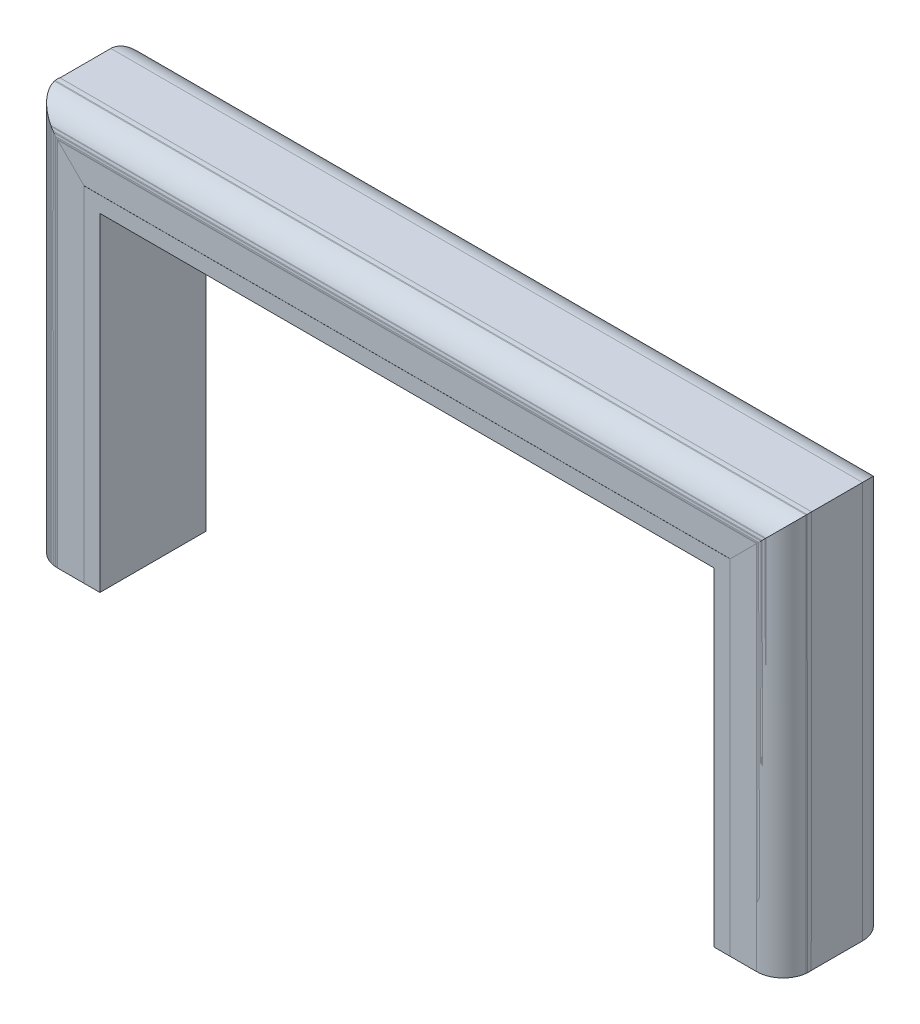
ISO-10303-21;
HEADER;
FILE_DESCRIPTION(('STEP AP214'),'2;1');
FILE_NAME('part.step','',(''),(''),'','','');
FILE_SCHEMA(('AUTOMOTIVE_DESIGN { 1 0 10303 214 1 1 1 1 }'));
ENDSEC;
DATA;
#1=APPLICATION_CONTEXT('core data for automotive mechanical design processes');
#2=APPLICATION_PROTOCOL_DEFINITION('international standard','automotive_design',2000,#1);
#3=PRODUCT_CONTEXT('',#1,'mechanical');
#4=PRODUCT('Part','Part','',(#3));
#5=PRODUCT_RELATED_PRODUCT_CATEGORY('part','',(#4));
#6=PRODUCT_DEFINITION_FORMATION('','',#4);
#7=PRODUCT_DEFINITION_CONTEXT('part definition',#1,'design');
#8=PRODUCT_DEFINITION('design','',#6,#7);
#9=PRODUCT_DEFINITION_SHAPE('','',#8);
#10=(LENGTH_UNIT() NAMED_UNIT(*) SI_UNIT(.MILLI.,.METRE.));
#11=(NAMED_UNIT(*) PLANE_ANGLE_UNIT() SI_UNIT($,.RADIAN.));
#12=(NAMED_UNIT(*) SI_UNIT($,.STERADIAN.) SOLID_ANGLE_UNIT());
#13=UNCERTAINTY_MEASURE_WITH_UNIT(LENGTH_MEASURE(1.E-05),#10,'distance_accuracy_value','');
#14=(GEOMETRIC_REPRESENTATION_CONTEXT(3) GLOBAL_UNCERTAINTY_ASSIGNED_CONTEXT((#13)) GLOBAL_UNIT_ASSIGNED_CONTEXT((#10,
#11,#12)) REPRESENTATION_CONTEXT('',''));
#15=CARTESIAN_POINT('',(0.,0.,0.));
#16=DIRECTION('',(0.,0.,1.));
#17=DIRECTION('',(1.,0.,0.));
#18=AXIS2_PLACEMENT_3D('',#15,#16,#17);
#19=CARTESIAN_POINT('',(0.126999999999988,0.,0.));
#20=DIRECTION('',(0.,1.,0.));
#21=DIRECTION('',(-1.,0.,0.));
#22=AXIS2_PLACEMENT_3D('',#19,#20,#21);
#23=PLANE('',#22);
#24=DIRECTION('',(0.,0.,-1.));
#25=VECTOR('',#24,1.);
#26=CARTESIAN_POINT('',(450.723,2.14008705028475E-12,0.));
#27=LINE('',#26,#25);
#28=CARTESIAN_POINT('',(450.723,2.1525109741519E-12,99.2580523948669));
#29=VERTEX_POINT('',#28);
#30=CARTESIAN_POINT('',(450.723,2.1525109741519E-12,31.623));
#31=VERTEX_POINT('',#30);
#32=EDGE_CURVE('E115',#29,#31,#27,.T.);
#33=ORIENTED_EDGE('',*,*,#32,.F.);
#34=CARTESIAN_POINT('',(419.227,1.98684066570759E-12,95.25));
#35=DIRECTION('',(0.,1.,0.));
#36=DIRECTION('',(-1.,0.,0.));
#37=AXIS2_PLACEMENT_3D('',#34,#35,#36);
#38=CIRCLE('',#37,31.75);
#39=CARTESIAN_POINT('',(419.227,1.99262111479377E-12,127.));
#40=VERTEX_POINT('',#39);
#41=EDGE_CURVE('E122',#40,#29,#38,.T.);
#42=ORIENTED_EDGE('',*,*,#41,.F.);
#43=DIRECTION('',(-1.,0.,0.));
#44=VECTOR('',#43,1.);
#45=CARTESIAN_POINT('',(0.126999999999988,0.,127.));
#46=LINE('',#45,#44);
#47=CARTESIAN_POINT('',(387.477,1.83211332694764E-12,127.));
#48=VERTEX_POINT('',#47);
#49=EDGE_CURVE('E130',#48,#40,#46,.F.);
#50=ORIENTED_EDGE('',*,*,#49,.F.);
#51=DIRECTION('',(0.,0.,-1.));
#52=VECTOR('',#51,1.);
#53=CARTESIAN_POINT('',(387.477,1.83235866326378E-12,0.));
#54=LINE('',#53,#52);
#55=CARTESIAN_POINT('',(387.477,1.83211332694764E-12,0.));
#56=VERTEX_POINT('',#55);
#57=EDGE_CURVE('E160',#56,#48,#54,.F.);
#58=ORIENTED_EDGE('',*,*,#57,.F.);
#59=DIRECTION('',(1.,0.,0.));
#60=VECTOR('',#59,1.);
#61=CARTESIAN_POINT('',(0.126999999999988,0.,0.));
#62=LINE('',#61,#60);
#63=CARTESIAN_POINT('',(419.1,1.99231215054977E-12,0.));
#64=VERTEX_POINT('',#63);
#65=EDGE_CURVE('E158',#64,#56,#62,.F.);
#66=ORIENTED_EDGE('',*,*,#65,.F.);
#67=CARTESIAN_POINT('',(419.1,1.9862220252348E-12,31.623));
#68=DIRECTION('',(0.,1.,0.));
#69=DIRECTION('',(-1.,0.,0.));
#70=AXIS2_PLACEMENT_3D('',#67,#68,#69);
#71=CIRCLE('',#70,31.623);
#72=EDGE_CURVE('E133',#31,#64,#71,.T.);
#73=ORIENTED_EDGE('',*,*,#72,.F.);
#74=EDGE_LOOP('',(#33,#42,#50,#58,#66,#73));
#75=FACE_BOUND('',#74,.T.);
#76=ADVANCED_FACE('F56',(#75),#23,.F.);
#77=CARTESIAN_POINT('',(0.,0.,0.));
#78=DIRECTION('',(0.,-1.,0.));
#79=DIRECTION('',(1.,0.,0.));
#80=AXIS2_PLACEMENT_3D('',#77,#78,#79);
#81=PLANE('',#80);
#82=DIRECTION('',(0.,0.,-1.));
#83=VECTOR('',#82,1.);
#84=CARTESIAN_POINT('',(-450.596,-2.13722818049158E-12,0.));
#85=LINE('',#84,#83);
#86=CARTESIAN_POINT('',(-450.596,-2.13722818049158E-12,99.2580523948669));
#87=VERTEX_POINT('',#86);
#88=CARTESIAN_POINT('',(-450.596,-2.13722818049158E-12,31.623));
#89=VERTEX_POINT('',#88);
#90=EDGE_CURVE('E190',#87,#89,#85,.T.);
#91=ORIENTED_EDGE('',*,*,#90,.T.);
#92=CARTESIAN_POINT('',(-418.973,-1.98723585601458E-12,31.623));
#93=DIRECTION('',(0.,-1.,0.));
#94=DIRECTION('',(1.,0.,0.));
#95=AXIS2_PLACEMENT_3D('',#92,#93,#94);
#96=CIRCLE('',#95,31.623);
#97=CARTESIAN_POINT('',(-418.973,-1.98723668755404E-12,0.));
#98=VERTEX_POINT('',#97);
#99=EDGE_CURVE('E218',#89,#98,#96,.T.);
#100=ORIENTED_EDGE('',*,*,#99,.T.);
#101=DIRECTION('',(-1.,0.,0.));
#102=VECTOR('',#101,1.);
#103=CARTESIAN_POINT('',(0.,0.,0.));
#104=LINE('',#103,#102);
#105=CARTESIAN_POINT('',(-387.35,-1.8372451946165E-12,0.));
#106=VERTEX_POINT('',#105);
#107=EDGE_CURVE('E212',#98,#106,#104,.F.);
#108=ORIENTED_EDGE('',*,*,#107,.T.);
#109=DIRECTION('',(0.,0.,-1.));
#110=VECTOR('',#109,1.);
#111=CARTESIAN_POINT('',(-387.35,-1.8372451946165E-12,0.));
#112=LINE('',#111,#110);
#113=CARTESIAN_POINT('',(-387.35,-1.8372451946165E-12,127.));
#114=VERTEX_POINT('',#113);
#115=EDGE_CURVE('E206',#106,#114,#112,.F.);
#116=ORIENTED_EDGE('',*,*,#115,.T.);
#117=DIRECTION('',(1.,0.,0.));
#118=VECTOR('',#117,1.);
#119=CARTESIAN_POINT('',(0.,0.,127.));
#120=LINE('',#119,#118);
#121=CARTESIAN_POINT('',(-419.1,-1.98783906302768E-12,127.));
#122=VERTEX_POINT('',#121);
#123=EDGE_CURVE('E200',#114,#122,#120,.F.);
#124=ORIENTED_EDGE('',*,*,#123,.T.);
#125=CARTESIAN_POINT('',(-419.1,-1.98783894347302E-12,95.25));
#126=DIRECTION('',(0.,-1.,0.));
#127=DIRECTION('',(1.,0.,0.));
#128=AXIS2_PLACEMENT_3D('',#125,#126,#127);
#129=CIRCLE('',#128,31.75);
#130=EDGE_CURVE('E196',#122,#87,#129,.T.);
#131=ORIENTED_EDGE('',*,*,#130,.T.);
#132=EDGE_LOOP('',(#91,#100,#108,#116,#124,#131));
#133=FACE_BOUND('',#132,.T.);
#134=ADVANCED_FACE('F285',(#133),#81,.T.);
#135=CARTESIAN_POINT('',(450.723,479.3853,0.));
#136=DIRECTION('',(-1.,0.,0.));
#137=DIRECTION('',(0.,-1.,0.));
#138=AXIS2_PLACEMENT_3D('',#135,#136,#137);
#139=PLANE('',#138);
#140=DIRECTION('',(0.,0.,1.));
#141=VECTOR('',#140,1.);
#142=CARTESIAN_POINT('',(450.723,476.123,0.));
#143=LINE('',#142,#141);
#144=CARTESIAN_POINT('',(450.723,476.123,31.623));
#145=VERTEX_POINT('',#144);
#146=CARTESIAN_POINT('',(450.723,476.123,99.2580523948669));
#147=VERTEX_POINT('',#146);
#148=EDGE_CURVE('E137',#145,#147,#143,.T.);
#149=ORIENTED_EDGE('',*,*,#148,.T.);
#150=DIRECTION('',(0.,-1.,0.));
#151=VECTOR('',#150,1.);
#152=CARTESIAN_POINT('',(450.723,479.3853,99.2580523948669));
#153=LINE('',#152,#151);
#154=EDGE_CURVE('E59',#147,#29,#153,.T.);
#155=ORIENTED_EDGE('',*,*,#154,.T.);
#156=ORIENTED_EDGE('',*,*,#32,.T.);
#157=DIRECTION('',(0.,-1.,0.));
#158=VECTOR('',#157,1.);
#159=CARTESIAN_POINT('',(450.723,479.3853,31.623));
#160=LINE('',#159,#158);
#161=EDGE_CURVE('E140',#145,#31,#160,.T.);
#162=ORIENTED_EDGE('',*,*,#161,.F.);
#163=EDGE_LOOP('',(#149,#155,#156,#162));
#164=FACE_BOUND('',#163,.T.);
#165=ADVANCED_FACE('F136',(#164),#139,.F.);
#166=CARTESIAN_POINT('',(419.1,479.3853,31.623));
#167=DIRECTION('',(0.,-1.,0.));
#168=DIRECTION('',(1.,0.,0.));
#169=AXIS2_PLACEMENT_3D('',#166,#167,#168);
#170=CYLINDRICAL_SURFACE('',#169,31.623);
#171=CARTESIAN_POINT('',(419.1,444.5,31.623));
#172=DIRECTION('',(0.707106781186548,-0.707106781186547,0.));
#173=DIRECTION('',(0.707106781186547,0.707106781186548,0.));
#174=AXIS2_PLACEMENT_3D('',#171,#172,#173);
#175=ELLIPSE('',#174,44.7216754829244,31.623);
#176=CARTESIAN_POINT('',(419.1,444.5,0.));
#177=VERTEX_POINT('',#176);
#178=EDGE_CURVE('E188',#177,#145,#175,.T.);
#179=ORIENTED_EDGE('',*,*,#178,.T.);
#180=ORIENTED_EDGE('',*,*,#161,.T.);
#181=ORIENTED_EDGE('',*,*,#72,.T.);
#182=DIRECTION('',(0.,-1.,0.));
#183=VECTOR('',#182,1.);
#184=CARTESIAN_POINT('',(419.1,479.3853,0.));
#185=LINE('',#184,#183);
#186=EDGE_CURVE('E144',#177,#64,#185,.T.);
#187=ORIENTED_EDGE('',*,*,#186,.F.);
#188=EDGE_LOOP('',(#179,#180,#181,#187));
#189=FACE_BOUND('',#188,.T.);
#190=ADVANCED_FACE('F297',(#189),#170,.T.);
#191=CARTESIAN_POINT('',(0.126999999999933,479.385299999998,0.));
#192=DIRECTION('',(0.,0.,1.));
#193=DIRECTION('',(1.,0.,0.));
#194=AXIS2_PLACEMENT_3D('',#191,#192,#193);
#195=PLANE('',#194);
#196=DIRECTION('',(0.707106781186547,0.707106781186548,0.));
#197=VECTOR('',#196,1.);
#198=CARTESIAN_POINT('',(-226.865649999999,-201.465649999999,0.));
#199=LINE('',#198,#197);
#200=CARTESIAN_POINT('',(387.477,412.877,0.));
#201=VERTEX_POINT('',#200);
#202=EDGE_CURVE('E185',#201,#177,#199,.T.);
#203=ORIENTED_EDGE('',*,*,#202,.T.);
#204=ORIENTED_EDGE('',*,*,#186,.T.);
#205=ORIENTED_EDGE('',*,*,#65,.T.);
#206=DIRECTION('',(0.,-1.,0.));
#207=VECTOR('',#206,1.);
#208=CARTESIAN_POINT('',(387.477,479.3853,0.));
#209=LINE('',#208,#207);
#210=EDGE_CURVE('E148',#201,#56,#209,.T.);
#211=ORIENTED_EDGE('',*,*,#210,.F.);
#212=EDGE_LOOP('',(#203,#204,#205,#211));
#213=FACE_BOUND('',#212,.T.);
#214=ADVANCED_FACE('F300',(#213),#195,.F.);
#215=CARTESIAN_POINT('',(387.477,479.3853,0.));
#216=DIRECTION('',(1.,0.,0.));
#217=DIRECTION('',(0.,1.,0.));
#218=AXIS2_PLACEMENT_3D('',#215,#216,#217);
#219=PLANE('',#218);
#220=DIRECTION('',(0.,0.,-1.));
#221=VECTOR('',#220,1.);
#222=CARTESIAN_POINT('',(387.477,412.877,0.));
#223=LINE('',#222,#221);
#224=CARTESIAN_POINT('',(387.477,412.877,127.));
#225=VERTEX_POINT('',#224);
#226=EDGE_CURVE('E182',#225,#201,#223,.T.);
#227=ORIENTED_EDGE('',*,*,#226,.T.);
#228=ORIENTED_EDGE('',*,*,#210,.T.);
#229=ORIENTED_EDGE('',*,*,#57,.T.);
#230=DIRECTION('',(0.,-1.,0.));
#231=VECTOR('',#230,1.);
#232=CARTESIAN_POINT('',(387.477,479.3853,127.));
#233=LINE('',#232,#231);
#234=EDGE_CURVE('E153',#225,#48,#233,.T.);
#235=ORIENTED_EDGE('',*,*,#234,.F.);
#236=EDGE_LOOP('',(#227,#228,#229,#235));
#237=FACE_BOUND('',#236,.T.);
#238=ADVANCED_FACE('F303',(#237),#219,.F.);
#239=CARTESIAN_POINT('',(0.126999999999933,479.385299999998,127.));
#240=DIRECTION('',(0.,0.,-1.));
#241=DIRECTION('',(-1.,0.,0.));
#242=AXIS2_PLACEMENT_3D('',#239,#240,#241);
#243=PLANE('',#242);
#244=DIRECTION('',(-0.707106781186547,-0.707106781186548,0.));
#245=VECTOR('',#244,1.);
#246=CARTESIAN_POINT('',(-226.865649999999,-201.465649999999,127.));
#247=LINE('',#246,#245);
#248=CARTESIAN_POINT('',(419.227,444.627,127.));
#249=VERTEX_POINT('',#248);
#250=EDGE_CURVE('E179',#249,#225,#247,.T.);
#251=ORIENTED_EDGE('',*,*,#250,.T.);
#252=ORIENTED_EDGE('',*,*,#234,.T.);
#253=ORIENTED_EDGE('',*,*,#49,.T.);
#254=DIRECTION('',(0.,-1.,0.));
#255=VECTOR('',#254,1.);
#256=CARTESIAN_POINT('',(419.227,479.3853,127.));
#257=LINE('',#256,#255);
#258=EDGE_CURVE('E127',#249,#40,#257,.T.);
#259=ORIENTED_EDGE('',*,*,#258,.F.);
#260=EDGE_LOOP('',(#251,#252,#253,#259));
#261=FACE_BOUND('',#260,.T.);
#262=ADVANCED_FACE('F305',(#261),#243,.F.);
#263=CARTESIAN_POINT('',(419.227,479.3853,95.25));
#264=DIRECTION('',(0.,-1.,0.));
#265=DIRECTION('',(1.,0.,0.));
#266=AXIS2_PLACEMENT_3D('',#263,#264,#265);
#267=CYLINDRICAL_SURFACE('',#266,31.75);
#268=CARTESIAN_POINT('',(419.227,444.627,95.25));
#269=DIRECTION('',(0.707106781186548,-0.707106781186547,0.));
#270=DIRECTION('',(0.707106781186547,0.707106781186548,0.));
#271=AXIS2_PLACEMENT_3D('',#268,#269,#270);
#272=ELLIPSE('',#271,44.9012806053458,31.75);
#273=EDGE_CURVE('E164',#147,#249,#272,.T.);
#274=ORIENTED_EDGE('',*,*,#273,.T.);
#275=ORIENTED_EDGE('',*,*,#258,.T.);
#276=ORIENTED_EDGE('',*,*,#41,.T.);
#277=ORIENTED_EDGE('',*,*,#154,.F.);
#278=EDGE_LOOP('',(#274,#275,#276,#277));
#279=FACE_BOUND('',#278,.T.);
#280=ADVANCED_FACE('F124',(#279),#267,.T.);
#281=CARTESIAN_POINT('',(-453.8583,444.627,95.25));
#282=DIRECTION('',(1.,0.,0.));
#283=DIRECTION('',(0.,0.,-1.));
#284=AXIS2_PLACEMENT_3D('',#281,#282,#283);
#285=CYLINDRICAL_SURFACE('',#284,31.75);
#286=DIRECTION('',(1.,0.,0.));
#287=VECTOR('',#286,1.);
#288=CARTESIAN_POINT('',(-453.8583,476.123,99.2580523948669));
#289=LINE('',#288,#287);
#290=CARTESIAN_POINT('',(-450.596,476.123,99.2580523948669));
#291=VERTEX_POINT('',#290);
#292=EDGE_CURVE('E165',#291,#147,#289,.T.);
#293=ORIENTED_EDGE('',*,*,#292,.F.);
#294=CARTESIAN_POINT('',(-419.1,444.627,95.25));
#295=DIRECTION('',(0.707106781186547,0.707106781186547,0.));
#296=DIRECTION('',(-0.707106781186548,0.707106781186548,0.));
#297=AXIS2_PLACEMENT_3D('',#294,#295,#296);
#298=ELLIPSE('',#297,44.9012806053458,31.75);
#299=CARTESIAN_POINT('',(-419.1,444.627,127.));
#300=VERTEX_POINT('',#299);
#301=EDGE_CURVE('E194',#291,#300,#298,.T.);
#302=ORIENTED_EDGE('',*,*,#301,.T.);
#303=DIRECTION('',(1.,0.,0.));
#304=VECTOR('',#303,1.);
#305=CARTESIAN_POINT('',(-453.8583,444.627,127.));
#306=LINE('',#305,#304);
#307=EDGE_CURVE('E139',#300,#249,#306,.T.);
#308=ORIENTED_EDGE('',*,*,#307,.T.);
#309=ORIENTED_EDGE('',*,*,#273,.F.);
#310=EDGE_LOOP('',(#293,#302,#308,#309));
#311=FACE_BOUND('',#310,.T.);
#312=ADVANCED_FACE('F308',(#311),#285,.T.);
#313=CARTESIAN_POINT('',(-453.858299999998,25.527,127.));
#314=DIRECTION('',(0.,0.,-1.));
#315=DIRECTION('',(-1.,0.,0.));
#316=AXIS2_PLACEMENT_3D('',#313,#314,#315);
#317=PLANE('',#316);
#318=ORIENTED_EDGE('',*,*,#307,.F.);
#319=DIRECTION('',(0.707106781186548,-0.707106781186548,0.));
#320=VECTOR('',#319,1.);
#321=CARTESIAN_POINT('',(12.7635,12.7635,127.));
#322=LINE('',#321,#320);
#323=CARTESIAN_POINT('',(-387.35,412.877,127.));
#324=VERTEX_POINT('',#323);
#325=EDGE_CURVE('E231',#300,#324,#322,.T.);
#326=ORIENTED_EDGE('',*,*,#325,.T.);
#327=DIRECTION('',(1.,0.,0.));
#328=VECTOR('',#327,1.);
#329=CARTESIAN_POINT('',(-453.8583,412.877,127.));
#330=LINE('',#329,#328);
#331=EDGE_CURVE('E142',#324,#225,#330,.T.);
#332=ORIENTED_EDGE('',*,*,#331,.T.);
#333=ORIENTED_EDGE('',*,*,#250,.F.);
#334=EDGE_LOOP('',(#318,#326,#332,#333));
#335=FACE_BOUND('',#334,.T.);
#336=ADVANCED_FACE('F280',(#335),#317,.F.);
#337=CARTESIAN_POINT('',(-453.8583,412.877,0.));
#338=DIRECTION('',(0.,1.,0.));
#339=DIRECTION('',(0.,0.,1.));
#340=AXIS2_PLACEMENT_3D('',#337,#338,#339);
#341=PLANE('',#340);
#342=ORIENTED_EDGE('',*,*,#331,.F.);
#343=DIRECTION('',(0.,0.,-1.));
#344=VECTOR('',#343,1.);
#345=CARTESIAN_POINT('',(-387.35,412.877,0.));
#346=LINE('',#345,#344);
#347=CARTESIAN_POINT('',(-387.35,412.877,0.));
#348=VERTEX_POINT('',#347);
#349=EDGE_CURVE('E234',#324,#348,#346,.T.);
#350=ORIENTED_EDGE('',*,*,#349,.T.);
#351=DIRECTION('',(1.,0.,0.));
#352=VECTOR('',#351,1.);
#353=CARTESIAN_POINT('',(-453.8583,412.877,0.));
#354=LINE('',#353,#352);
#355=EDGE_CURVE('E173',#348,#201,#354,.T.);
#356=ORIENTED_EDGE('',*,*,#355,.T.);
#357=ORIENTED_EDGE('',*,*,#226,.F.);
#358=EDGE_LOOP('',(#342,#350,#356,#357));
#359=FACE_BOUND('',#358,.T.);
#360=ADVANCED_FACE('F276',(#359),#341,.F.);
#361=CARTESIAN_POINT('',(-453.858299999998,25.527,0.));
#362=DIRECTION('',(0.,0.,1.));
#363=DIRECTION('',(1.,0.,0.));
#364=AXIS2_PLACEMENT_3D('',#361,#362,#363);
#365=PLANE('',#364);
#366=ORIENTED_EDGE('',*,*,#355,.F.);
#367=DIRECTION('',(-0.707106781186548,0.707106781186548,0.));
#368=VECTOR('',#367,1.);
#369=CARTESIAN_POINT('',(12.7635,12.7635,0.));
#370=LINE('',#369,#368);
#371=CARTESIAN_POINT('',(-418.973,444.5,0.));
#372=VERTEX_POINT('',#371);
#373=EDGE_CURVE('E65',#348,#372,#370,.T.);
#374=ORIENTED_EDGE('',*,*,#373,.T.);
#375=DIRECTION('',(1.,0.,0.));
#376=VECTOR('',#375,1.);
#377=CARTESIAN_POINT('',(-453.8583,444.5,0.));
#378=LINE('',#377,#376);
#379=EDGE_CURVE('E170',#372,#177,#378,.T.);
#380=ORIENTED_EDGE('',*,*,#379,.T.);
#381=ORIENTED_EDGE('',*,*,#202,.F.);
#382=EDGE_LOOP('',(#366,#374,#380,#381));
#383=FACE_BOUND('',#382,.T.);
#384=ADVANCED_FACE('F240',(#383),#365,.F.);
#385=CARTESIAN_POINT('',(-453.8583,444.5,31.623));
#386=DIRECTION('',(1.,0.,0.));
#387=DIRECTION('',(0.,0.,-1.));
#388=AXIS2_PLACEMENT_3D('',#385,#386,#387);
#389=CYLINDRICAL_SURFACE('',#388,31.623);
#390=ORIENTED_EDGE('',*,*,#379,.F.);
#391=CARTESIAN_POINT('',(-418.973,444.5,31.623));
#392=DIRECTION('',(0.707106781186547,0.707106781186547,0.));
#393=DIRECTION('',(-0.707106781186548,0.707106781186548,0.));
#394=AXIS2_PLACEMENT_3D('',#391,#392,#393);
#395=ELLIPSE('',#394,44.7216754829244,31.623);
#396=CARTESIAN_POINT('',(-450.596,476.123,31.623));
#397=VERTEX_POINT('',#396);
#398=EDGE_CURVE('E12',#372,#397,#395,.T.);
#399=ORIENTED_EDGE('',*,*,#398,.T.);
#400=DIRECTION('',(1.,0.,0.));
#401=VECTOR('',#400,1.);
#402=CARTESIAN_POINT('',(-453.8583,476.123,31.623));
#403=LINE('',#402,#401);
#404=EDGE_CURVE('E167',#397,#145,#403,.T.);
#405=ORIENTED_EDGE('',*,*,#404,.T.);
#406=ORIENTED_EDGE('',*,*,#178,.F.);
#407=EDGE_LOOP('',(#390,#399,#405,#406));
#408=FACE_BOUND('',#407,.T.);
#409=ADVANCED_FACE('F295',(#408),#389,.T.);
#410=CARTESIAN_POINT('',(-453.8583,476.123,0.));
#411=DIRECTION('',(0.,-1.,0.));
#412=DIRECTION('',(0.,0.,-1.));
#413=AXIS2_PLACEMENT_3D('',#410,#411,#412);
#414=PLANE('',#413);
#415=ORIENTED_EDGE('',*,*,#404,.F.);
#416=DIRECTION('',(0.,0.,1.));
#417=VECTOR('',#416,1.);
#418=CARTESIAN_POINT('',(-450.596,476.123,0.));
#419=LINE('',#418,#417);
#420=EDGE_CURVE('E191',#397,#291,#419,.T.);
#421=ORIENTED_EDGE('',*,*,#420,.T.);
#422=ORIENTED_EDGE('',*,*,#292,.T.);
#423=ORIENTED_EDGE('',*,*,#148,.F.);
#424=EDGE_LOOP('',(#415,#421,#422,#423));
#425=FACE_BOUND('',#424,.T.);
#426=ADVANCED_FACE('F293',(#425),#414,.F.);
#427=CARTESIAN_POINT('',(-419.1,-1.98783894347302E-12,95.25));
#428=DIRECTION('',(0.,1.,0.));
#429=DIRECTION('',(0.,0.,1.));
#430=AXIS2_PLACEMENT_3D('',#427,#428,#429);
#431=CYLINDRICAL_SURFACE('',#430,31.75);
#432=DIRECTION('',(0.,1.,0.));
#433=VECTOR('',#432,1.);
#434=CARTESIAN_POINT('',(-450.596,-2.13722818049158E-12,99.2580523948669));
#435=LINE('',#434,#433);
#436=EDGE_CURVE('E199',#87,#291,#435,.T.);
#437=ORIENTED_EDGE('',*,*,#436,.F.);
#438=ORIENTED_EDGE('',*,*,#130,.F.);
#439=DIRECTION('',(0.,1.,0.));
#440=VECTOR('',#439,1.);
#441=CARTESIAN_POINT('',(-419.1,-1.98783906302768E-12,127.));
#442=LINE('',#441,#440);
#443=EDGE_CURVE('E195',#122,#300,#442,.T.);
#444=ORIENTED_EDGE('',*,*,#443,.T.);
#445=ORIENTED_EDGE('',*,*,#301,.F.);
#446=EDGE_LOOP('',(#437,#438,#444,#445));
#447=FACE_BOUND('',#446,.T.);
#448=ADVANCED_FACE('F310',(#447),#431,.T.);
#449=CARTESIAN_POINT('',(0.,0.,127.));
#450=DIRECTION('',(0.,0.,-1.));
#451=DIRECTION('',(-1.,0.,0.));
#452=AXIS2_PLACEMENT_3D('',#449,#450,#451);
#453=PLANE('',#452);
#454=ORIENTED_EDGE('',*,*,#443,.F.);
#455=ORIENTED_EDGE('',*,*,#123,.F.);
#456=DIRECTION('',(0.,1.,0.));
#457=VECTOR('',#456,1.);
#458=CARTESIAN_POINT('',(-387.35,-1.8372451946165E-12,127.));
#459=LINE('',#458,#457);
#460=EDGE_CURVE('E203',#114,#324,#459,.T.);
#461=ORIENTED_EDGE('',*,*,#460,.T.);
#462=ORIENTED_EDGE('',*,*,#325,.F.);
#463=EDGE_LOOP('',(#454,#455,#461,#462));
#464=FACE_BOUND('',#463,.T.);
#465=ADVANCED_FACE('F283',(#464),#453,.F.);
#466=CARTESIAN_POINT('',(-387.35,-1.8372451946165E-12,0.));
#467=DIRECTION('',(-1.,0.,0.));
#468=DIRECTION('',(0.,0.,1.));
#469=AXIS2_PLACEMENT_3D('',#466,#467,#468);
#470=PLANE('',#469);
#471=ORIENTED_EDGE('',*,*,#460,.F.);
#472=ORIENTED_EDGE('',*,*,#115,.F.);
#473=DIRECTION('',(0.,1.,0.));
#474=VECTOR('',#473,1.);
#475=CARTESIAN_POINT('',(-387.35,-1.8372451946165E-12,0.));
#476=LINE('',#475,#474);
#477=EDGE_CURVE('E209',#106,#348,#476,.T.);
#478=ORIENTED_EDGE('',*,*,#477,.T.);
#479=ORIENTED_EDGE('',*,*,#349,.F.);
#480=EDGE_LOOP('',(#471,#472,#478,#479));
#481=FACE_BOUND('',#480,.T.);
#482=ADVANCED_FACE('F274',(#481),#470,.F.);
#483=CARTESIAN_POINT('',(0.,0.,0.));
#484=DIRECTION('',(0.,0.,1.));
#485=DIRECTION('',(1.,0.,0.));
#486=AXIS2_PLACEMENT_3D('',#483,#484,#485);
#487=PLANE('',#486);
#488=ORIENTED_EDGE('',*,*,#477,.F.);
#489=ORIENTED_EDGE('',*,*,#107,.F.);
#490=DIRECTION('',(0.,1.,0.));
#491=VECTOR('',#490,1.);
#492=CARTESIAN_POINT('',(-418.973,-1.98723668755404E-12,0.));
#493=LINE('',#492,#491);
#494=EDGE_CURVE('E215',#98,#372,#493,.T.);
#495=ORIENTED_EDGE('',*,*,#494,.T.);
#496=ORIENTED_EDGE('',*,*,#373,.F.);
#497=EDGE_LOOP('',(#488,#489,#495,#496));
#498=FACE_BOUND('',#497,.T.);
#499=ADVANCED_FACE('F244',(#498),#487,.F.);
#500=CARTESIAN_POINT('',(-418.973,-1.98723585601458E-12,31.623));
#501=DIRECTION('',(0.,1.,0.));
#502=DIRECTION('',(0.,0.,1.));
#503=AXIS2_PLACEMENT_3D('',#500,#501,#502);
#504=CYLINDRICAL_SURFACE('',#503,31.623);
#505=ORIENTED_EDGE('',*,*,#494,.F.);
#506=ORIENTED_EDGE('',*,*,#99,.F.);
#507=DIRECTION('',(0.,1.,0.));
#508=VECTOR('',#507,1.);
#509=CARTESIAN_POINT('',(-450.596,-2.13722818049158E-12,31.623));
#510=LINE('',#509,#508);
#511=EDGE_CURVE('E221',#89,#397,#510,.T.);
#512=ORIENTED_EDGE('',*,*,#511,.T.);
#513=ORIENTED_EDGE('',*,*,#398,.F.);
#514=EDGE_LOOP('',(#505,#506,#512,#513));
#515=FACE_BOUND('',#514,.T.);
#516=ADVANCED_FACE('F247',(#515),#504,.T.);
#517=CARTESIAN_POINT('',(-450.596,-2.13722818049158E-12,0.));
#518=DIRECTION('',(1.,0.,0.));
#519=DIRECTION('',(0.,0.,-1.));
#520=AXIS2_PLACEMENT_3D('',#517,#518,#519);
#521=PLANE('',#520);
#522=ORIENTED_EDGE('',*,*,#511,.F.);
#523=ORIENTED_EDGE('',*,*,#90,.F.);
#524=ORIENTED_EDGE('',*,*,#436,.T.);
#525=ORIENTED_EDGE('',*,*,#420,.F.);
#526=EDGE_LOOP('',(#522,#523,#524,#525));
#527=FACE_BOUND('',#526,.T.);
#528=ADVANCED_FACE('F290',(#527),#521,.F.);
#529=CLOSED_SHELL('',(#76,#134,#165,#190,#214,#238,#262,#280,#312,#336,#360,#384,#409,#426,#448,
#465,#482,#499,#516,#528));
#530=MANIFOLD_SOLID_BREP('B2',#529);
#531=CARTESIAN_POINT('',(418.973,0.,31.623));
#532=DIRECTION('',(0.,1.,0.));
#533=DIRECTION('',(-1.,0.,0.));
#534=AXIS2_PLACEMENT_3D('',#531,#532,#533);
#535=PLANE('',#534);
#536=CARTESIAN_POINT('',(418.973,0.,31.623));
#537=DIRECTION('',(0.,1.,0.));
#538=DIRECTION('',(-1.,0.,0.));
#539=AXIS2_PLACEMENT_3D('',#536,#537,#538);
#540=CIRCLE('',#539,31.623);
#541=CARTESIAN_POINT('',(387.35,0.,31.623));
#542=VERTEX_POINT('',#541);
#543=EDGE_CURVE('E522',#542,#542,#540,.T.);
#544=ORIENTED_EDGE('',*,*,#543,.F.);
#545=EDGE_LOOP('',(#544));
#546=FACE_BOUND('',#545,.T.);
#547=ADVANCED_FACE('F519',(#546),#535,.F.);
#548=CARTESIAN_POINT('',(-418.973,0.,31.623));
#549=DIRECTION('',(0.,-1.,0.));
#550=DIRECTION('',(1.,0.,0.));
#551=AXIS2_PLACEMENT_3D('',#548,#549,#550);
#552=PLANE('',#551);
#553=CARTESIAN_POINT('',(-418.973,0.,31.623));
#554=DIRECTION('',(0.,-1.,0.));
#555=DIRECTION('',(1.,0.,0.));
#556=AXIS2_PLACEMENT_3D('',#553,#554,#555);
#557=CIRCLE('',#556,31.623);
#558=CARTESIAN_POINT('',(-387.35,0.,31.623));
#559=VERTEX_POINT('',#558);
#560=EDGE_CURVE('E526',#559,#559,#557,.T.);
#561=ORIENTED_EDGE('',*,*,#560,.T.);
#562=EDGE_LOOP('',(#561));
#563=FACE_BOUND('',#562,.T.);
#564=ADVANCED_FACE('F542',(#563),#552,.T.);
#565=CARTESIAN_POINT('',(418.973,479.2456,31.623));
#566=DIRECTION('',(0.,-1.,0.));
#567=DIRECTION('',(1.,0.,0.));
#568=AXIS2_PLACEMENT_3D('',#565,#566,#567);
#569=CYLINDRICAL_SURFACE('',#568,31.623);
#570=CARTESIAN_POINT('',(418.973,444.373,31.623));
#571=DIRECTION('',(0.707106781186548,-0.707106781186548,0.));
#572=DIRECTION('',(0.707106781186547,0.707106781186548,0.));
#573=AXIS2_PLACEMENT_3D('',#570,#571,#572);
#574=ELLIPSE('',#573,44.7216754829244,31.623);
#575=CARTESIAN_POINT('',(450.596,475.996,31.623));
#576=VERTEX_POINT('',#575);
#577=EDGE_CURVE('E531',#576,#576,#574,.T.);
#578=ORIENTED_EDGE('',*,*,#577,.T.);
#579=EDGE_LOOP('',(#578));
#580=FACE_BOUND('',#579,.T.);
#581=ORIENTED_EDGE('',*,*,#543,.T.);
#582=EDGE_LOOP('',(#581));
#583=FACE_BOUND('',#582,.T.);
#584=ADVANCED_FACE('F539',(#580,#583),#569,.T.);
#585=CARTESIAN_POINT('',(-453.8456,444.373,31.623));
#586=DIRECTION('',(1.,0.,0.));
#587=DIRECTION('',(0.,0.,-1.));
#588=AXIS2_PLACEMENT_3D('',#585,#586,#587);
#589=CYLINDRICAL_SURFACE('',#588,31.623);
#590=CARTESIAN_POINT('',(-418.973,444.373,31.623));
#591=DIRECTION('',(0.707106781186548,0.707106781186548,0.));
#592=DIRECTION('',(-0.707106781186548,0.707106781186548,0.));
#593=AXIS2_PLACEMENT_3D('',#590,#591,#592);
#594=ELLIPSE('',#593,44.7216754829244,31.623);
#595=CARTESIAN_POINT('',(-450.596,475.996,31.623));
#596=VERTEX_POINT('',#595);
#597=EDGE_CURVE('E55',#596,#596,#594,.T.);
#598=ORIENTED_EDGE('',*,*,#597,.T.);
#599=EDGE_LOOP('',(#598));
#600=FACE_BOUND('',#599,.T.);
#601=ORIENTED_EDGE('',*,*,#577,.F.);
#602=EDGE_LOOP('',(#601));
#603=FACE_BOUND('',#602,.T.);
#604=ADVANCED_FACE('F549',(#600,#603),#589,.T.);
#605=CARTESIAN_POINT('',(-418.973,0.,31.623));
#606=DIRECTION('',(0.,1.,0.));
#607=DIRECTION('',(0.,0.,1.));
#608=AXIS2_PLACEMENT_3D('',#605,#606,#607);
#609=CYLINDRICAL_SURFACE('',#608,31.623);
#610=ORIENTED_EDGE('',*,*,#560,.F.);
#611=EDGE_LOOP('',(#610));
#612=FACE_BOUND('',#611,.T.);
#613=ORIENTED_EDGE('',*,*,#597,.F.);
#614=EDGE_LOOP('',(#613));
#615=FACE_BOUND('',#614,.T.);
#616=ADVANCED_FACE('F547',(#612,#615),#609,.T.);
#617=CLOSED_SHELL('',(#547,#564,#584,#604,#616));
#618=MANIFOLD_SOLID_BREP('B6',#617);
#619=CARTESIAN_POINT('',(419.1,0.,95.25));
#620=DIRECTION('',(0.,1.,0.));
#621=DIRECTION('',(-1.,0.,0.));
#622=AXIS2_PLACEMENT_3D('',#619,#620,#621);
#623=PLANE('',#622);
#624=CARTESIAN_POINT('',(419.1,0.,95.25));
#625=DIRECTION('',(0.,1.,0.));
#626=DIRECTION('',(-1.,0.,0.));
#627=AXIS2_PLACEMENT_3D('',#624,#625,#626);
#628=CIRCLE('',#627,31.75);
#629=CARTESIAN_POINT('',(387.35,0.,95.25));
#630=VERTEX_POINT('',#629);
#631=EDGE_CURVE('E612',#630,#630,#628,.T.);
#632=ORIENTED_EDGE('',*,*,#631,.F.);
#633=EDGE_LOOP('',(#632));
#634=FACE_BOUND('',#633,.T.);
#635=ADVANCED_FACE('F609',(#634),#623,.F.);
#636=CARTESIAN_POINT('',(-419.1,0.,95.25));
#637=DIRECTION('',(0.,-1.,0.));
#638=DIRECTION('',(1.,0.,0.));
#639=AXIS2_PLACEMENT_3D('',#636,#637,#638);
#640=PLANE('',#639);
#641=CARTESIAN_POINT('',(-419.1,0.,95.25));
#642=DIRECTION('',(0.,-1.,0.));
#643=DIRECTION('',(1.,0.,0.));
#644=AXIS2_PLACEMENT_3D('',#641,#642,#643);
#645=CIRCLE('',#644,31.75);
#646=CARTESIAN_POINT('',(-387.35,0.,95.25));
#647=VERTEX_POINT('',#646);
#648=EDGE_CURVE('E616',#647,#647,#645,.T.);
#649=ORIENTED_EDGE('',*,*,#648,.T.);
#650=EDGE_LOOP('',(#649));
#651=FACE_BOUND('',#650,.T.);
#652=ADVANCED_FACE('F632',(#651),#640,.T.);
#653=CARTESIAN_POINT('',(419.1,479.525,95.25));
#654=DIRECTION('',(0.,-1.,0.));
#655=DIRECTION('',(1.,0.,0.));
#656=AXIS2_PLACEMENT_3D('',#653,#654,#655);
#657=CYLINDRICAL_SURFACE('',#656,31.75);
#658=CARTESIAN_POINT('',(419.1,444.5,95.25));
#659=DIRECTION('',(0.707106781186548,-0.707106781186548,0.));
#660=DIRECTION('',(0.707106781186547,0.707106781186548,0.));
#661=AXIS2_PLACEMENT_3D('',#658,#659,#660);
#662=ELLIPSE('',#661,44.9012806053457,31.75);
#663=CARTESIAN_POINT('',(450.85,476.25,95.25));
#664=VERTEX_POINT('',#663);
#665=EDGE_CURVE('E621',#664,#664,#662,.T.);
#666=ORIENTED_EDGE('',*,*,#665,.T.);
#667=EDGE_LOOP('',(#666));
#668=FACE_BOUND('',#667,.T.);
#669=ORIENTED_EDGE('',*,*,#631,.T.);
#670=EDGE_LOOP('',(#669));
#671=FACE_BOUND('',#670,.T.);
#672=ADVANCED_FACE('F629',(#668,#671),#657,.T.);
#673=CARTESIAN_POINT('',(-454.125,444.5,95.25));
#674=DIRECTION('',(1.,0.,0.));
#675=DIRECTION('',(0.,0.,-1.));
#676=AXIS2_PLACEMENT_3D('',#673,#674,#675);
#677=CYLINDRICAL_SURFACE('',#676,31.75);
#678=CARTESIAN_POINT('',(-419.1,444.5,95.25));
#679=DIRECTION('',(0.707106781186548,0.707106781186548,0.));
#680=DIRECTION('',(-0.707106781186548,0.707106781186548,0.));
#681=AXIS2_PLACEMENT_3D('',#678,#679,#680);
#682=ELLIPSE('',#681,44.9012806053457,31.75);
#683=CARTESIAN_POINT('',(-450.85,476.25,95.25));
#684=VERTEX_POINT('',#683);
#685=EDGE_CURVE('E518',#684,#684,#682,.T.);
#686=ORIENTED_EDGE('',*,*,#685,.T.);
#687=EDGE_LOOP('',(#686));
#688=FACE_BOUND('',#687,.T.);
#689=ORIENTED_EDGE('',*,*,#665,.F.);
#690=EDGE_LOOP('',(#689));
#691=FACE_BOUND('',#690,.T.);
#692=ADVANCED_FACE('F639',(#688,#691),#677,.T.);
#693=CARTESIAN_POINT('',(-419.1,0.,95.25));
#694=DIRECTION('',(0.,1.,0.));
#695=DIRECTION('',(0.,0.,1.));
#696=AXIS2_PLACEMENT_3D('',#693,#694,#695);
#697=CYLINDRICAL_SURFACE('',#696,31.75);
#698=ORIENTED_EDGE('',*,*,#648,.F.);
#699=EDGE_LOOP('',(#698));
#700=FACE_BOUND('',#699,.T.);
#701=ORIENTED_EDGE('',*,*,#685,.F.);
#702=EDGE_LOOP('',(#701));
#703=FACE_BOUND('',#702,.T.);
#704=ADVANCED_FACE('F637',(#700,#703),#697,.T.);
#705=CLOSED_SHELL('',(#635,#652,#672,#692,#704));
#706=MANIFOLD_SOLID_BREP('B50',#705);
#707=CARTESIAN_POINT('',(-368.3,0.,127.));
#708=DIRECTION('',(0.,1.,0.));
#709=DIRECTION('',(-1.,0.,0.));
#710=AXIS2_PLACEMENT_3D('',#707,#708,#709);
#711=PLANE('',#710);
#712=DIRECTION('',(1.,0.,0.));
#713=VECTOR('',#712,1.);
#714=CARTESIAN_POINT('',(-368.3,0.,0.));
#715=LINE('',#714,#713);
#716=CARTESIAN_POINT('',(-387.35,0.,0.));
#717=VERTEX_POINT('',#716);
#718=CARTESIAN_POINT('',(-368.3,0.,0.));
#719=VERTEX_POINT('',#718);
#720=EDGE_CURVE('E786',#717,#719,#715,.T.);
#721=ORIENTED_EDGE('',*,*,#720,.T.);
#722=DIRECTION('',(0.,0.,-1.));
#723=VECTOR('',#722,1.);
#724=CARTESIAN_POINT('',(-368.3,0.,127.));
#725=LINE('',#724,#723);
#726=CARTESIAN_POINT('',(-368.3,0.,127.));
#727=VERTEX_POINT('',#726);
#728=EDGE_CURVE('E607',#727,#719,#725,.T.);
#729=ORIENTED_EDGE('',*,*,#728,.F.);
#730=DIRECTION('',(1.,0.,0.));
#731=VECTOR('',#730,1.);
#732=CARTESIAN_POINT('',(-368.3,0.,127.));
#733=LINE('',#732,#731);
#734=CARTESIAN_POINT('',(-387.35,0.,127.));
#735=VERTEX_POINT('',#734);
#736=EDGE_CURVE('E800',#735,#727,#733,.T.);
#737=ORIENTED_EDGE('',*,*,#736,.F.);
#738=DIRECTION('',(0.,0.,-1.));
#739=VECTOR('',#738,1.);
#740=CARTESIAN_POINT('',(-387.35,0.,127.));
#741=LINE('',#740,#739);
#742=EDGE_CURVE('E782',#735,#717,#741,.T.);
#743=ORIENTED_EDGE('',*,*,#742,.T.);
#744=EDGE_LOOP('',(#721,#729,#737,#743));
#745=FACE_BOUND('',#744,.T.);
#746=ADVANCED_FACE('F690',(#745),#711,.F.);
#747=CARTESIAN_POINT('',(-368.3,393.7,127.));
#748=DIRECTION('',(-1.,0.,0.));
#749=DIRECTION('',(0.,-1.,0.));
#750=AXIS2_PLACEMENT_3D('',#747,#748,#749);
#751=PLANE('',#750);
#752=DIRECTION('',(0.,1.,0.));
#753=VECTOR('',#752,1.);
#754=CARTESIAN_POINT('',(-368.3,393.7,0.));
#755=LINE('',#754,#753);
#756=CARTESIAN_POINT('',(-368.3,393.7,0.));
#757=VERTEX_POINT('',#756);
#758=EDGE_CURVE('E789',#719,#757,#755,.T.);
#759=ORIENTED_EDGE('',*,*,#758,.T.);
#760=DIRECTION('',(0.,0.,-1.));
#761=VECTOR('',#760,1.);
#762=CARTESIAN_POINT('',(-368.3,393.7,127.));
#763=LINE('',#762,#761);
#764=CARTESIAN_POINT('',(-368.3,393.7,127.));
#765=VERTEX_POINT('',#764);
#766=EDGE_CURVE('E698',#765,#757,#763,.T.);
#767=ORIENTED_EDGE('',*,*,#766,.F.);
#768=DIRECTION('',(0.,1.,0.));
#769=VECTOR('',#768,1.);
#770=CARTESIAN_POINT('',(-368.3,393.7,127.));
#771=LINE('',#770,#769);
#772=EDGE_CURVE('E749',#727,#765,#771,.T.);
#773=ORIENTED_EDGE('',*,*,#772,.F.);
#774=ORIENTED_EDGE('',*,*,#728,.T.);
#775=EDGE_LOOP('',(#759,#767,#773,#774));
#776=FACE_BOUND('',#775,.T.);
#777=ADVANCED_FACE('F835',(#776),#751,.F.);
#778=CARTESIAN_POINT('',(368.3,393.7,127.));
#779=DIRECTION('',(0.,1.,0.));
#780=DIRECTION('',(0.,0.,1.));
#781=AXIS2_PLACEMENT_3D('',#778,#779,#780);
#782=PLANE('',#781);
#783=DIRECTION('',(1.,0.,0.));
#784=VECTOR('',#783,1.);
#785=CARTESIAN_POINT('',(368.3,393.7,0.));
#786=LINE('',#785,#784);
#787=CARTESIAN_POINT('',(368.3,393.7,0.));
#788=VERTEX_POINT('',#787);
#789=EDGE_CURVE('E791',#757,#788,#786,.T.);
#790=ORIENTED_EDGE('',*,*,#789,.T.);
#791=DIRECTION('',(0.,0.,-1.));
#792=VECTOR('',#791,1.);
#793=CARTESIAN_POINT('',(368.3,393.7,127.));
#794=LINE('',#793,#792);
#795=CARTESIAN_POINT('',(368.3,393.7,127.));
#796=VERTEX_POINT('',#795);
#797=EDGE_CURVE('E807',#796,#788,#794,.T.);
#798=ORIENTED_EDGE('',*,*,#797,.F.);
#799=DIRECTION('',(1.,0.,0.));
#800=VECTOR('',#799,1.);
#801=CARTESIAN_POINT('',(368.3,393.7,127.));
#802=LINE('',#801,#800);
#803=EDGE_CURVE('E815',#765,#796,#802,.T.);
#804=ORIENTED_EDGE('',*,*,#803,.F.);
#805=ORIENTED_EDGE('',*,*,#766,.T.);
#806=EDGE_LOOP('',(#790,#798,#804,#805));
#807=FACE_BOUND('',#806,.T.);
#808=ADVANCED_FACE('F813',(#807),#782,.F.);
#809=CARTESIAN_POINT('',(368.3,0.,127.));
#810=DIRECTION('',(1.,0.,0.));
#811=DIRECTION('',(0.,1.,0.));
#812=AXIS2_PLACEMENT_3D('',#809,#810,#811);
#813=PLANE('',#812);
#814=DIRECTION('',(0.,-1.,0.));
#815=VECTOR('',#814,1.);
#816=CARTESIAN_POINT('',(368.3,0.,0.));
#817=LINE('',#816,#815);
#818=CARTESIAN_POINT('',(368.3,0.,0.));
#819=VERTEX_POINT('',#818);
#820=EDGE_CURVE('E793',#788,#819,#817,.T.);
#821=ORIENTED_EDGE('',*,*,#820,.T.);
#822=DIRECTION('',(0.,0.,-1.));
#823=VECTOR('',#822,1.);
#824=CARTESIAN_POINT('',(368.3,0.,127.));
#825=LINE('',#824,#823);
#826=CARTESIAN_POINT('',(368.3,0.,127.));
#827=VERTEX_POINT('',#826);
#828=EDGE_CURVE('E804',#827,#819,#825,.T.);
#829=ORIENTED_EDGE('',*,*,#828,.F.);
#830=DIRECTION('',(0.,-1.,0.));
#831=VECTOR('',#830,1.);
#832=CARTESIAN_POINT('',(368.3,0.,127.));
#833=LINE('',#832,#831);
#834=EDGE_CURVE('E827',#796,#827,#833,.T.);
#835=ORIENTED_EDGE('',*,*,#834,.F.);
#836=ORIENTED_EDGE('',*,*,#797,.T.);
#837=EDGE_LOOP('',(#821,#829,#835,#836));
#838=FACE_BOUND('',#837,.T.);
#839=ADVANCED_FACE('F823',(#838),#813,.F.);
#840=CARTESIAN_POINT('',(387.35,0.,127.));
#841=DIRECTION('',(0.,1.,0.));
#842=DIRECTION('',(-1.,0.,0.));
#843=AXIS2_PLACEMENT_3D('',#840,#841,#842);
#844=PLANE('',#843);
#845=DIRECTION('',(1.,0.,0.));
#846=VECTOR('',#845,1.);
#847=CARTESIAN_POINT('',(387.35,0.,0.));
#848=LINE('',#847,#846);
#849=CARTESIAN_POINT('',(387.35,0.,0.));
#850=VERTEX_POINT('',#849);
#851=EDGE_CURVE('E795',#819,#850,#848,.T.);
#852=ORIENTED_EDGE('',*,*,#851,.T.);
#853=DIRECTION('',(0.,0.,-1.));
#854=VECTOR('',#853,1.);
#855=CARTESIAN_POINT('',(387.35,0.,127.));
#856=LINE('',#855,#854);
#857=CARTESIAN_POINT('',(387.35,0.,127.));
#858=VERTEX_POINT('',#857);
#859=EDGE_CURVE('E777',#858,#850,#856,.T.);
#860=ORIENTED_EDGE('',*,*,#859,.F.);
#861=DIRECTION('',(1.,0.,0.));
#862=VECTOR('',#861,1.);
#863=CARTESIAN_POINT('',(387.35,0.,127.));
#864=LINE('',#863,#862);
#865=EDGE_CURVE('E768',#827,#858,#864,.T.);
#866=ORIENTED_EDGE('',*,*,#865,.F.);
#867=ORIENTED_EDGE('',*,*,#828,.T.);
#868=EDGE_LOOP('',(#852,#860,#866,#867));
#869=FACE_BOUND('',#868,.T.);
#870=ADVANCED_FACE('F826',(#869),#844,.F.);
#871=CARTESIAN_POINT('',(387.35,412.75,127.));
#872=DIRECTION('',(-1.,0.,0.));
#873=DIRECTION('',(0.,0.,1.));
#874=AXIS2_PLACEMENT_3D('',#871,#872,#873);
#875=PLANE('',#874);
#876=DIRECTION('',(0.,1.,0.));
#877=VECTOR('',#876,1.);
#878=CARTESIAN_POINT('',(387.35,412.75,0.));
#879=LINE('',#878,#877);
#880=CARTESIAN_POINT('',(387.35,412.75,0.));
#881=VERTEX_POINT('',#880);
#882=EDGE_CURVE('E776',#850,#881,#879,.T.);
#883=ORIENTED_EDGE('',*,*,#882,.T.);
#884=DIRECTION('',(0.,0.,-1.));
#885=VECTOR('',#884,1.);
#886=CARTESIAN_POINT('',(387.35,412.75,127.));
#887=LINE('',#886,#885);
#888=CARTESIAN_POINT('',(387.35,412.75,127.));
#889=VERTEX_POINT('',#888);
#890=EDGE_CURVE('E773',#889,#881,#887,.T.);
#891=ORIENTED_EDGE('',*,*,#890,.F.);
#892=DIRECTION('',(0.,1.,0.));
#893=VECTOR('',#892,1.);
#894=CARTESIAN_POINT('',(387.35,412.75,127.));
#895=LINE('',#894,#893);
#896=EDGE_CURVE('E762',#858,#889,#895,.T.);
#897=ORIENTED_EDGE('',*,*,#896,.F.);
#898=ORIENTED_EDGE('',*,*,#859,.T.);
#899=EDGE_LOOP('',(#883,#891,#897,#898));
#900=FACE_BOUND('',#899,.T.);
#901=ADVANCED_FACE('F774',(#900),#875,.F.);
#902=CARTESIAN_POINT('',(-387.35,412.75,127.));
#903=DIRECTION('',(0.,-1.,0.));
#904=DIRECTION('',(0.,0.,-1.));
#905=AXIS2_PLACEMENT_3D('',#902,#903,#904);
#906=PLANE('',#905);
#907=DIRECTION('',(-1.,0.,0.));
#908=VECTOR('',#907,1.);
#909=CARTESIAN_POINT('',(-387.35,412.75,0.));
#910=LINE('',#909,#908);
#911=CARTESIAN_POINT('',(-387.35,412.75,0.));
#912=VERTEX_POINT('',#911);
#913=EDGE_CURVE('E735',#881,#912,#910,.T.);
#914=ORIENTED_EDGE('',*,*,#913,.T.);
#915=DIRECTION('',(0.,0.,-1.));
#916=VECTOR('',#915,1.);
#917=CARTESIAN_POINT('',(-387.35,412.75,127.));
#918=LINE('',#917,#916);
#919=CARTESIAN_POINT('',(-387.35,412.75,127.));
#920=VERTEX_POINT('',#919);
#921=EDGE_CURVE('E778',#920,#912,#918,.T.);
#922=ORIENTED_EDGE('',*,*,#921,.F.);
#923=DIRECTION('',(-1.,0.,0.));
#924=VECTOR('',#923,1.);
#925=CARTESIAN_POINT('',(-387.35,412.75,127.));
#926=LINE('',#925,#924);
#927=EDGE_CURVE('E766',#889,#920,#926,.T.);
#928=ORIENTED_EDGE('',*,*,#927,.F.);
#929=ORIENTED_EDGE('',*,*,#890,.T.);
#930=EDGE_LOOP('',(#914,#922,#928,#929));
#931=FACE_BOUND('',#930,.T.);
#932=ADVANCED_FACE('F780',(#931),#906,.F.);
#933=CARTESIAN_POINT('',(-387.35,0.,127.));
#934=DIRECTION('',(1.,0.,0.));
#935=DIRECTION('',(0.,0.,-1.));
#936=AXIS2_PLACEMENT_3D('',#933,#934,#935);
#937=PLANE('',#936);
#938=DIRECTION('',(0.,-1.,0.));
#939=VECTOR('',#938,1.);
#940=CARTESIAN_POINT('',(-387.35,0.,0.));
#941=LINE('',#940,#939);
#942=EDGE_CURVE('E741',#912,#717,#941,.T.);
#943=ORIENTED_EDGE('',*,*,#942,.T.);
#944=ORIENTED_EDGE('',*,*,#742,.F.);
#945=DIRECTION('',(0.,-1.,0.));
#946=VECTOR('',#945,1.);
#947=CARTESIAN_POINT('',(-387.35,0.,127.));
#948=LINE('',#947,#946);
#949=EDGE_CURVE('E706',#920,#735,#948,.T.);
#950=ORIENTED_EDGE('',*,*,#949,.F.);
#951=ORIENTED_EDGE('',*,*,#921,.T.);
#952=EDGE_LOOP('',(#943,#944,#950,#951));
#953=FACE_BOUND('',#952,.T.);
#954=ADVANCED_FACE('F851',(#953),#937,.F.);
#955=CARTESIAN_POINT('',(0.,0.,127.));
#956=DIRECTION('',(0.,0.,-1.));
#957=DIRECTION('',(-1.,0.,0.));
#958=AXIS2_PLACEMENT_3D('',#955,#956,#957);
#959=PLANE('',#958);
#960=ORIENTED_EDGE('',*,*,#736,.T.);
#961=ORIENTED_EDGE('',*,*,#772,.T.);
#962=ORIENTED_EDGE('',*,*,#803,.T.);
#963=ORIENTED_EDGE('',*,*,#834,.T.);
#964=ORIENTED_EDGE('',*,*,#865,.T.);
#965=ORIENTED_EDGE('',*,*,#896,.T.);
#966=ORIENTED_EDGE('',*,*,#927,.T.);
#967=ORIENTED_EDGE('',*,*,#949,.T.);
#968=EDGE_LOOP('',(#960,#961,#962,#963,#964,#965,#966,#967));
#969=FACE_BOUND('',#968,.T.);
#970=ADVANCED_FACE('F764',(#969),#959,.F.);
#971=CARTESIAN_POINT('',(0.,0.,0.));
#972=DIRECTION('',(0.,0.,-1.));
#973=DIRECTION('',(-1.,0.,0.));
#974=AXIS2_PLACEMENT_3D('',#971,#972,#973);
#975=PLANE('',#974);
#976=ORIENTED_EDGE('',*,*,#720,.F.);
#977=ORIENTED_EDGE('',*,*,#942,.F.);
#978=ORIENTED_EDGE('',*,*,#913,.F.);
#979=ORIENTED_EDGE('',*,*,#882,.F.);
#980=ORIENTED_EDGE('',*,*,#851,.F.);
#981=ORIENTED_EDGE('',*,*,#820,.F.);
#982=ORIENTED_EDGE('',*,*,#789,.F.);
#983=ORIENTED_EDGE('',*,*,#758,.F.);
#984=EDGE_LOOP('',(#976,#977,#978,#979,#980,#981,#982,#983));
#985=FACE_BOUND('',#984,.T.);
#986=ADVANCED_FACE('F819',(#985),#975,.T.);
#987=CLOSED_SHELL('',(#746,#777,#808,#839,#870,#901,#932,#954,#970,#986));
#988=MANIFOLD_SOLID_BREP('B513',#987);
#989=ADVANCED_BREP_SHAPE_REPRESENTATION('',(#18,#530,#618,#706,#988),#14);
#990=SHAPE_DEFINITION_REPRESENTATION(#9,#989);
ENDSEC;
END-ISO-10303-21;
